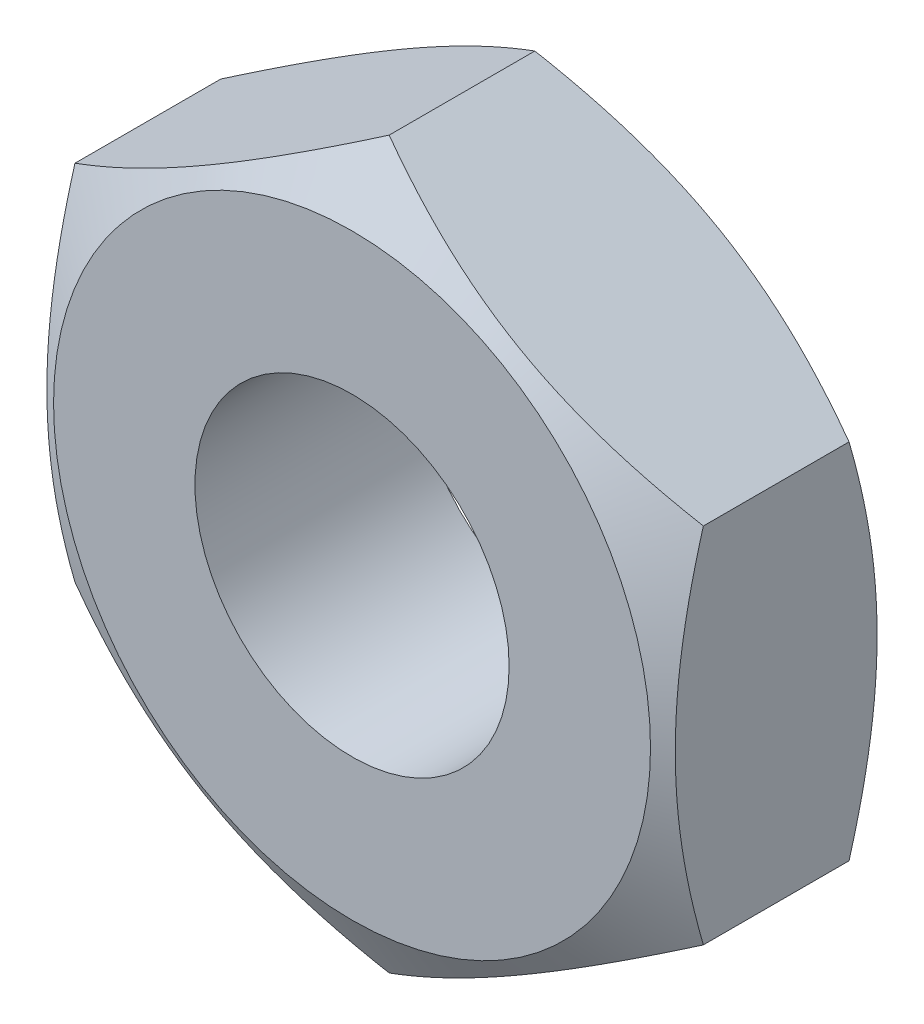
ISO-10303-21;
HEADER;
FILE_DESCRIPTION(('STEP AP214'),'2;1');
FILE_NAME('part.step','',(''),(''),'','','');
FILE_SCHEMA(('AUTOMOTIVE_DESIGN { 1 0 10303 214 1 1 1 1 }'));
ENDSEC;
DATA;
#1=APPLICATION_CONTEXT('core data for automotive mechanical design processes');
#2=APPLICATION_PROTOCOL_DEFINITION('international standard','automotive_design',2000,#1);
#3=PRODUCT_CONTEXT('',#1,'mechanical');
#4=PRODUCT('Part','Part','',(#3));
#5=PRODUCT_RELATED_PRODUCT_CATEGORY('part','',(#4));
#6=PRODUCT_DEFINITION_FORMATION('','',#4);
#7=PRODUCT_DEFINITION_CONTEXT('part definition',#1,'design');
#8=PRODUCT_DEFINITION('design','',#6,#7);
#9=PRODUCT_DEFINITION_SHAPE('','',#8);
#10=(LENGTH_UNIT() NAMED_UNIT(*) SI_UNIT(.MILLI.,.METRE.));
#11=(NAMED_UNIT(*) PLANE_ANGLE_UNIT() SI_UNIT($,.RADIAN.));
#12=(NAMED_UNIT(*) SI_UNIT($,.STERADIAN.) SOLID_ANGLE_UNIT());
#13=UNCERTAINTY_MEASURE_WITH_UNIT(LENGTH_MEASURE(1.E-05),#10,'distance_accuracy_value','');
#14=(GEOMETRIC_REPRESENTATION_CONTEXT(3) GLOBAL_UNCERTAINTY_ASSIGNED_CONTEXT((#13)) GLOBAL_UNIT_ASSIGNED_CONTEXT((#10,
#11,#12)) REPRESENTATION_CONTEXT('',''));
#15=CARTESIAN_POINT('',(0.,0.,0.));
#16=DIRECTION('',(0.,0.,1.));
#17=DIRECTION('',(1.,0.,0.));
#18=AXIS2_PLACEMENT_3D('',#15,#16,#17);
#19=CARTESIAN_POINT('',(0.,0.,1.75));
#20=DIRECTION('',(0.,0.,1.));
#21=DIRECTION('',(1.,0.,0.));
#22=AXIS2_PLACEMENT_3D('',#19,#20,#21);
#23=PLANE('',#22);
#24=CARTESIAN_POINT('',(0.,0.,1.75));
#25=DIRECTION('',(0.,0.,1.));
#26=DIRECTION('',(1.,0.,0.));
#27=AXIS2_PLACEMENT_3D('',#24,#25,#26);
#28=CIRCLE('',#27,1.25);
#29=CARTESIAN_POINT('',(1.25,0.,1.75));
#30=VERTEX_POINT('',#29);
#31=EDGE_CURVE('E116',#30,#30,#28,.T.);
#32=ORIENTED_EDGE('',*,*,#31,.F.);
#33=EDGE_LOOP('',(#32));
#34=FACE_BOUND('',#33,.T.);
#35=CARTESIAN_POINT('',(0.,0.,1.75));
#36=DIRECTION('',(0.,0.,1.));
#37=DIRECTION('',(0.,-1.,0.));
#38=AXIS2_PLACEMENT_3D('',#35,#36,#37);
#39=CIRCLE('',#38,2.375);
#40=CARTESIAN_POINT('',(0.,-2.375,1.75));
#41=VERTEX_POINT('',#40);
#42=EDGE_CURVE('E109',#41,#41,#39,.T.);
#43=ORIENTED_EDGE('',*,*,#42,.T.);
#44=EDGE_LOOP('',(#43));
#45=FACE_BOUND('',#44,.T.);
#46=ADVANCED_FACE('F37',(#34,#45),#23,.T.);
#47=CARTESIAN_POINT('',(0.,0.,0.));
#48=DIRECTION('',(0.,0.,1.));
#49=DIRECTION('',(1.,0.,0.));
#50=AXIS2_PLACEMENT_3D('',#47,#48,#49);
#51=PLANE('',#50);
#52=CARTESIAN_POINT('',(0.,0.,0.));
#53=DIRECTION('',(0.,0.,1.));
#54=DIRECTION('',(1.,0.,0.));
#55=AXIS2_PLACEMENT_3D('',#52,#53,#54);
#56=CIRCLE('',#55,1.25);
#57=CARTESIAN_POINT('',(1.25,0.,0.));
#58=VERTEX_POINT('',#57);
#59=EDGE_CURVE('E196',#58,#58,#56,.T.);
#60=ORIENTED_EDGE('',*,*,#59,.T.);
#61=EDGE_LOOP('',(#60));
#62=FACE_BOUND('',#61,.T.);
#63=CARTESIAN_POINT('',(0.,0.,0.));
#64=DIRECTION('',(0.,0.,1.));
#65=DIRECTION('',(0.,-1.,0.));
#66=AXIS2_PLACEMENT_3D('',#63,#64,#65);
#67=CIRCLE('',#66,2.375);
#68=CARTESIAN_POINT('',(0.,-2.375,0.));
#69=VERTEX_POINT('',#68);
#70=EDGE_CURVE('E218',#69,#69,#67,.T.);
#71=ORIENTED_EDGE('',*,*,#70,.F.);
#72=EDGE_LOOP('',(#71));
#73=FACE_BOUND('',#72,.T.);
#74=ADVANCED_FACE('F201',(#62,#73),#51,.F.);
#75=CARTESIAN_POINT('',(0.,0.,1.75));
#76=DIRECTION('',(0.,0.,-1.));
#77=DIRECTION('',(-1.,0.,0.));
#78=AXIS2_PLACEMENT_3D('',#75,#76,#77);
#79=CYLINDRICAL_SURFACE('',#78,1.25);
#80=ORIENTED_EDGE('',*,*,#31,.T.);
#81=EDGE_LOOP('',(#80));
#82=FACE_BOUND('',#81,.T.);
#83=ORIENTED_EDGE('',*,*,#59,.F.);
#84=EDGE_LOOP('',(#83));
#85=FACE_BOUND('',#84,.T.);
#86=ADVANCED_FACE('F137',(#82,#85),#79,.F.);
#87=CARTESIAN_POINT('',(0.,0.,0.));
#88=DIRECTION('',(0.,0.,1.));
#89=DIRECTION('',(0.,-1.,0.));
#90=AXIS2_PLACEMENT_3D('',#87,#88,#89);
#91=CONICAL_SURFACE('',#90,2.375,1.0471975511966);
#92=ORIENTED_EDGE('',*,*,#70,.T.);
#93=EDGE_LOOP('',(#92));
#94=FACE_BOUND('',#93,.T.);
#95=CARTESIAN_POINT('',(2.5,-3.86763946392755,1.2876547106161));
#96=CARTESIAN_POINT('',(2.5,-3.75852551583649,1.23476270966801));
#97=CARTESIAN_POINT('',(2.5,-3.64916006780465,1.18238060529101));
#98=CARTESIAN_POINT('',(2.5,-3.42979238777927,1.07892316223086));
#99=CARTESIAN_POINT('',(2.5,-3.31979005786967,1.02784803139998));
#100=CARTESIAN_POINT('',(2.5,-3.09844353829973,0.927032534868438));
#101=CARTESIAN_POINT('',(2.5,-2.98709529758184,0.877301032608486));
#102=CARTESIAN_POINT('',(2.5,-2.763509858222,0.779885915241073));
#103=CARTESIAN_POINT('',(2.5,-2.65127270216652,0.732202202721919));
#104=CARTESIAN_POINT('',(2.5,-2.42214755064801,0.637949580190284));
#105=CARTESIAN_POINT('',(2.5,-2.30522503270314,0.591464132652693));
#106=CARTESIAN_POINT('',(2.5,-2.07000857851044,0.502034372702592));
#107=CARTESIAN_POINT('',(2.5,-1.95171448954618,0.459090459022853));
#108=CARTESIAN_POINT('',(2.5,-1.71379120381976,0.37787801577161));
#109=CARTESIAN_POINT('',(2.5,-1.59416529867955,0.339599940278691));
#110=CARTESIAN_POINT('',(2.5,-1.35319758460224,0.268953701601422));
#111=CARTESIAN_POINT('',(2.5,-1.23185633217851,0.236583667012194));
#112=CARTESIAN_POINT('',(2.5,-0.988059377504647,0.179484531718637));
#113=CARTESIAN_POINT('',(2.5,-0.865613455515869,0.154714443946999));
#114=CARTESIAN_POINT('',(2.5,-0.619208800947298,0.114222367082637));
#115=CARTESIAN_POINT('',(2.5,-0.495250210215586,0.0984995361558203));
#116=CARTESIAN_POINT('',(2.5,-0.248054781354333,0.0775622736933038));
#117=CARTESIAN_POINT('',(2.5,-0.124829609324288,0.0722134876273881));
#118=CARTESIAN_POINT('',(2.5,0.121634587761786,0.0721246690618955));
#119=CARTESIAN_POINT('',(2.5,0.244873613061071,0.0773848676112145));
#120=CARTESIAN_POINT('',(2.5,0.454374089317983,0.0949742062526064));
#121=CARTESIAN_POINT('',(2.5,0.540860910537124,0.104772198187143));
#122=CARTESIAN_POINT('',(2.5,0.71319319520709,0.128977756388591));
#123=CARTESIAN_POINT('',(2.5,0.799038568697896,0.143385957243784));
#124=CARTESIAN_POINT('',(2.5,1.05549131811364,0.192769927586583));
#125=CARTESIAN_POINT('',(2.5,1.22491769803913,0.233895793155265));
#126=CARTESIAN_POINT('',(2.5,1.56399109003585,0.329140332292541));
#127=CARTESIAN_POINT('',(2.5,1.73356005553691,0.383526326465631));
#128=CARTESIAN_POINT('',(2.5,1.98556190300135,0.471619784669561));
#129=CARTESIAN_POINT('',(2.5,2.06916180670617,0.502066425736758));
#130=CARTESIAN_POINT('',(2.5,2.23567245075201,0.564789103682635));
#131=CARTESIAN_POINT('',(2.5,2.31858319901662,0.597065119494532));
#132=CARTESIAN_POINT('',(2.5,2.5136844428125,0.675092139926096));
#133=CARTESIAN_POINT('',(2.5,2.62561423262604,0.721493115013614));
#134=CARTESIAN_POINT('',(2.5,2.84852673344899,0.816522186017045));
#135=CARTESIAN_POINT('',(2.5,2.95950939063121,0.865150407524381));
#136=CARTESIAN_POINT('',(2.5,3.29131956302076,1.01368578341017));
#137=CARTESIAN_POINT('',(2.5,3.51096663954438,1.11622616340681));
#138=CARTESIAN_POINT('',(2.5,3.94827453766853,1.32596159051718));
#139=CARTESIAN_POINT('',(2.5,4.16593313820459,1.43316121755294));
#140=CARTESIAN_POINT('',(2.5,4.59968673432788,1.65069000943157));
#141=CARTESIAN_POINT('',(2.5,4.8157816731443,1.76101928719212));
#142=CARTESIAN_POINT('',(2.5,5.22882322283796,1.97458148645121));
#143=CARTESIAN_POINT('',(2.5,5.42586165180805,2.07763744333484));
#144=CARTESIAN_POINT('',(2.5,5.81920826161873,2.28514868976634));
#145=CARTESIAN_POINT('',(2.5,6.01551641676818,2.3896040279608));
#146=CARTESIAN_POINT('',(2.5,6.40707981927931,2.59932311390836));
#147=CARTESIAN_POINT('',(2.5,6.60233646830583,2.70458424849236));
#148=CARTESIAN_POINT('',(2.5,6.99238254653373,2.91594374155117));
#149=CARTESIAN_POINT('',(2.5,7.1871720006058,3.02204205410905));
#150=CARTESIAN_POINT('',(2.5,7.38178938540182,3.12845289523728));
#151=B_SPLINE_CURVE_WITH_KNOTS('',3,(#95,#96,#97,#98,#99,#100,#101,#102,#103,#104,#105,#106,
#107,#108,#109,#110,#111,#112,#113,#114,#115,#116,#117,#118,#119,#120,#121,#122,#123,#124,#125,
#126,#127,#128,#129,#130,#131,#132,#133,#134,#135,#136,#137,#138,#139,#140,#141,#142,#143,#144,
#145,#146,#147,#148,#149,#150),.UNSPECIFIED.,.F.,.F.,(4,2,2,2,2,2,2,2,2,2,2,2,2,2,2,2,2,2,2,2,2,
2,2,2,2,2,2,4),(0.,0.363777438860027,0.727612375341775,1.09344403056899,1.45925826416178,
1.83668704075984,2.21415825330651,2.59084374525286,2.96740971210786,3.34190760940305,
3.71637065457635,4.08595075587306,4.4555389061961,4.71653329113484,4.9775636170216,
5.49991709335266,6.03382700833079,6.30072511977744,6.56762015829288,6.93108793833044,
7.29457623912,8.02169102368103,8.74953746575718,9.47741020198852,10.1444884101497,
10.8115898683916,11.477054113278,12.1424821095168),.UNSPECIFIED.);
#152=CARTESIAN_POINT('',(2.5,-1.44337567297453,0.29545977734099));
#153=VERTEX_POINT('',#152);
#154=CARTESIAN_POINT('',(2.5,1.44337567297407,0.295459777341305));
#155=VERTEX_POINT('',#154);
#156=EDGE_CURVE('E51',#153,#155,#151,.T.);
#157=ORIENTED_EDGE('',*,*,#156,.F.);
#158=CARTESIAN_POINT('',(-0.000200000000000318,-2.88686681600197,0.295526448007812));
#159=CARTESIAN_POINT('',(0.109663234734871,-2.82343724785375,0.258890403756329));
#160=CARTESIAN_POINT('',(0.220474799896525,-2.75946016087834,0.22557100261376));
#161=CARTESIAN_POINT('',(0.444016833466049,-2.63039810762178,0.167411069206561));
#162=CARTESIAN_POINT('',(0.556751274528388,-2.5653108477275,0.142591112796441));
#163=CARTESIAN_POINT('',(0.780822993875269,-2.43594298024479,0.103954435089755));
#164=CARTESIAN_POINT('',(0.892125791767377,-2.37168227992023,0.0898805798343417));
#165=CARTESIAN_POINT('',(1.11525522746833,-2.24285844015415,0.073077936001453));
#166=CARTESIAN_POINT('',(1.22708105401423,-2.17829576909553,0.0703352348523293));
#167=CARTESIAN_POINT('',(1.43604197555152,-2.05765212479586,0.0760345436567563));
#168=CARTESIAN_POINT('',(1.53320831755773,-2.0015531110824,0.0830771780305646));
#169=CARTESIAN_POINT('',(1.726907949711,-1.88972057631678,0.105400202773646));
#170=CARTESIAN_POINT('',(1.82344056965973,-1.8339874422038,0.12068822208897));
#171=CARTESIAN_POINT('',(2.01753972174048,-1.7219242445005,0.158907877493124));
#172=CARTESIAN_POINT('',(2.11508168178214,-1.66560836761316,0.182001559774221));
#173=CARTESIAN_POINT('',(2.30871060807609,-1.55381665489446,0.234415440226617));
#174=CARTESIAN_POINT('',(2.40480005588618,-1.49833938633502,0.263723319273252));
#175=CARTESIAN_POINT('',(2.5002,-1.44326020292023,0.295526448007812));
#176=B_SPLINE_CURVE_WITH_KNOTS('',3,(#158,#159,#160,#161,#162,#163,#164,#165,#166,#167,#168,
#169,#170,#171,#172,#173,#174,#175),.UNSPECIFIED.,.F.,.F.,(4,2,2,2,2,2,2,2,4),(0.,
0.396285827362227,0.793524330152051,1.18093086852114,1.56786160134475,1.90479741793733,
2.24204551660463,2.58677531536756,2.93082800105257),.UNSPECIFIED.);
#177=CARTESIAN_POINT('',(0.,-2.88675134594813,0.295459777341305));
#178=VERTEX_POINT('',#177);
#179=EDGE_CURVE('E94',#178,#153,#176,.T.);
#180=ORIENTED_EDGE('',*,*,#179,.F.);
#181=CARTESIAN_POINT('',(-2.5002,-1.44326020292023,0.295526448007812));
#182=CARTESIAN_POINT('',(-2.39033676526513,-1.50668977106845,0.258890403756329));
#183=CARTESIAN_POINT('',(-2.27952520010347,-1.57066685804385,0.225571002613759));
#184=CARTESIAN_POINT('',(-2.05598316653395,-1.69972891130041,0.167411069206561));
#185=CARTESIAN_POINT('',(-1.94324872547161,-1.7648161711947,0.142591112796442));
#186=CARTESIAN_POINT('',(-1.71917700612473,-1.8941840386774,0.103954435089755));
#187=CARTESIAN_POINT('',(-1.60787420823262,-1.95844473900197,0.089880579834342));
#188=CARTESIAN_POINT('',(-1.38474477253167,-2.08726857876805,0.0730779360014533));
#189=CARTESIAN_POINT('',(-1.27291894598577,-2.15183124982667,0.0703352348523298));
#190=CARTESIAN_POINT('',(-1.06395802444848,-2.27247489412634,0.0760345436567566));
#191=CARTESIAN_POINT('',(-0.966791682442269,-2.32857390783979,0.0830771780305647));
#192=CARTESIAN_POINT('',(-0.773092050288997,-2.44040644260542,0.105400202773646));
#193=CARTESIAN_POINT('',(-0.676559430340268,-2.4961395767184,0.12068822208897));
#194=CARTESIAN_POINT('',(-0.482460278259524,-2.60820277442169,0.158907877493124));
#195=CARTESIAN_POINT('',(-0.384918318217859,-2.66451865130903,0.18200155977422));
#196=CARTESIAN_POINT('',(-0.191289391923915,-2.77631036402774,0.234415440226616));
#197=CARTESIAN_POINT('',(-0.0951999441138243,-2.83178763258718,0.263723319273252));
#198=CARTESIAN_POINT('',(0.000199999999999583,-2.88686681600197,0.295526448007812));
#199=B_SPLINE_CURVE_WITH_KNOTS('',3,(#181,#182,#183,#184,#185,#186,#187,#188,#189,#190,#191,
#192,#193,#194,#195,#196,#197,#198),.UNSPECIFIED.,.F.,.F.,(4,2,2,2,2,2,2,2,4),(0.,
0.396285827362227,0.793524330152051,1.18093086852114,1.56786160134475,1.90479741793733,
2.24204551660463,2.58677531536756,2.93082800105256),.UNSPECIFIED.);
#200=CARTESIAN_POINT('',(-2.5,-1.44337567297407,0.295459777341305));
#201=VERTEX_POINT('',#200);
#202=EDGE_CURVE('E108',#201,#178,#199,.T.);
#203=ORIENTED_EDGE('',*,*,#202,.F.);
#204=CARTESIAN_POINT('',(-2.5,-3.86763946389854,1.28765471060203));
#205=CARTESIAN_POINT('',(-2.5,-3.75852551580845,1.23476270965453));
#206=CARTESIAN_POINT('',(-2.5,-3.64916006777759,1.18238060527812));
#207=CARTESIAN_POINT('',(-2.5,-3.42979238775417,1.07892316221915));
#208=CARTESIAN_POINT('',(-2.5,-3.31979005784554,1.02784803138885));
#209=CARTESIAN_POINT('',(-2.5,-3.09844353827758,0.927032534858483));
#210=CARTESIAN_POINT('',(-2.5,-2.98709529756068,0.877301032599117));
#211=CARTESIAN_POINT('',(-2.5,-2.76350985820283,0.779885915232867));
#212=CARTESIAN_POINT('',(-2.5,-2.65127270214835,0.73220220271429));
#213=CARTESIAN_POINT('',(-2.5,-2.42214755063191,0.637949580183822));
#214=CARTESIAN_POINT('',(-2.5,-2.30522503268812,0.59146413264682));
#215=CARTESIAN_POINT('',(-2.5,-2.07000857849758,0.502034372697865));
#216=CARTESIAN_POINT('',(-2.5,-1.95171448953441,0.459090459018684));
#217=CARTESIAN_POINT('',(-2.5,-1.7137912038102,0.3778780157685));
#218=CARTESIAN_POINT('',(-2.5,-1.59416529867111,0.339599940276083));
#219=CARTESIAN_POINT('',(-2.5,-1.35319758459605,0.268953701599735));
#220=CARTESIAN_POINT('',(-2.5,-1.23185633217346,0.236583667010927));
#221=CARTESIAN_POINT('',(-2.5,-0.988059377502483,0.179484531718212));
#222=CARTESIAN_POINT('',(-2.5,-0.865613455515453,0.154714443946965));
#223=CARTESIAN_POINT('',(-2.5,-0.619208800950423,0.114222367083116));
#224=CARTESIAN_POINT('',(-2.5,-0.495250210220502,0.0984995361564233));
#225=CARTESIAN_POINT('',(-2.5,-0.248054781362798,0.0775622736938365));
#226=CARTESIAN_POINT('',(-2.5,-0.124829609334513,0.0722134876277324));
#227=CARTESIAN_POINT('',(-2.5,0.121634587748071,0.07212466906156));
#228=CARTESIAN_POINT('',(-2.5,0.244873613045626,0.0773848676103875));
#229=CARTESIAN_POINT('',(-2.5,0.454374089300341,0.0949742062507923));
#230=CARTESIAN_POINT('',(-2.5,0.540860910518998,0.104772198184935));
#231=CARTESIAN_POINT('',(-2.5,0.713193195188015,0.128977756385575));
#232=CARTESIAN_POINT('',(-2.5,0.799038568678358,0.143385957240352));
#233=CARTESIAN_POINT('',(-2.5,1.05549131809274,0.192769927581897));
#234=CARTESIAN_POINT('',(-2.5,1.22491769801735,0.233895793149731));
#235=CARTESIAN_POINT('',(-2.5,1.56399109001231,0.32914033228533));
#236=CARTESIAN_POINT('',(-2.5,1.73356005551248,0.38352632645759));
#237=CARTESIAN_POINT('',(-2.5,1.98556190297561,0.471619784660316));
#238=CARTESIAN_POINT('',(-2.5,2.06916180667999,0.502066425727119));
#239=CARTESIAN_POINT('',(-2.5,2.23567245072495,0.564789103672221));
#240=CARTESIAN_POINT('',(-2.5,2.31858319898912,0.597065119483736));
#241=CARTESIAN_POINT('',(-2.5,2.5136844427847,0.675092139914706));
#242=CARTESIAN_POINT('',(-2.5,2.62561423259837,0.721493115002036));
#243=CARTESIAN_POINT('',(-2.5,2.84852673342155,0.816522186005133));
#244=CARTESIAN_POINT('',(-2.5,2.95950939060389,0.865150407512324));
#245=CARTESIAN_POINT('',(-2.5,3.29131956299375,1.01368578339773));
#246=CARTESIAN_POINT('',(-2.5,3.51096663951756,1.11622616339418));
#247=CARTESIAN_POINT('',(-2.5,3.94827453764206,1.32596159050425));
#248=CARTESIAN_POINT('',(-2.5,4.16593313817829,1.4331612175399));
#249=CARTESIAN_POINT('',(-2.5,4.59968673430187,1.65069000941837));
#250=CARTESIAN_POINT('',(-2.5,4.81578167311844,1.76101928717886));
#251=CARTESIAN_POINT('',(-2.5,5.22882322281225,1.97458148643781));
#252=CARTESIAN_POINT('',(-2.5,5.42586165178236,2.07763744332137));
#253=CARTESIAN_POINT('',(-2.5,5.81920826159307,2.28514868975272));
#254=CARTESIAN_POINT('',(-2.5,6.01551641674254,2.38960402794712));
#255=CARTESIAN_POINT('',(-2.5,6.40707981925366,2.59932311389456));
#256=CARTESIAN_POINT('',(-2.5,6.60233646828017,2.7045842484785));
#257=CARTESIAN_POINT('',(-2.5,6.99238254650804,2.9159437415372));
#258=CARTESIAN_POINT('',(-2.5,7.18717200058009,3.02204205409503));
#259=CARTESIAN_POINT('',(-2.5,7.3817893853761,3.12845289522321));
#260=B_SPLINE_CURVE_WITH_KNOTS('',3,(#204,#205,#206,#207,#208,#209,#210,#211,#212,#213,#214,
#215,#216,#217,#218,#219,#220,#221,#222,#223,#224,#225,#226,#227,#228,#229,#230,#231,#232,#233,
#234,#235,#236,#237,#238,#239,#240,#241,#242,#243,#244,#245,#246,#247,#248,#249,#250,#251,#252,
#253,#254,#255,#256,#257,#258,#259),.UNSPECIFIED.,.F.,.F.,(4,2,2,2,2,2,2,2,2,2,2,2,2,2,2,2,2,2,
2,2,2,2,2,2,2,2,2,4),(0.,0.363777438856627,0.727612375334975,1.09344403055875,1.4592582641481,
1.83668704074251,2.21415825328553,2.59084374522825,2.96740971207962,3.34190760936945,
3.71637065453738,4.08595075582887,4.45553890614668,4.71653329108384,4.97756361696902,
5.49991709329692,6.03382700827176,6.30072511971677,6.56762015823057,6.93108793826827,
7.29457623905795,8.02169102361925,8.74953746569569,9.47741020192732,10.1444884100885,
10.8115898683303,11.4770541132166,12.1424821094552),.UNSPECIFIED.);
#261=CARTESIAN_POINT('',(-2.5,1.44337567297406,0.295459777341306));
#262=VERTEX_POINT('',#261);
#263=EDGE_CURVE('E157',#262,#201,#260,.F.);
#264=ORIENTED_EDGE('',*,*,#263,.F.);
#265=CARTESIAN_POINT('',(0.000199999999999662,2.88686681600197,0.295526448007812));
#266=CARTESIAN_POINT('',(-0.109663234734871,2.82343724785375,0.258890403756329));
#267=CARTESIAN_POINT('',(-0.220474799896526,2.75946016087834,0.22557100261376));
#268=CARTESIAN_POINT('',(-0.44401683346605,2.63039810762178,0.167411069206561));
#269=CARTESIAN_POINT('',(-0.556751274528389,2.5653108477275,0.142591112796441));
#270=CARTESIAN_POINT('',(-0.780822993875269,2.43594298024479,0.103954435089755));
#271=CARTESIAN_POINT('',(-0.892125791767377,2.37168227992023,0.089880579834342));
#272=CARTESIAN_POINT('',(-1.11525522746833,2.24285844015415,0.0730779360014533));
#273=CARTESIAN_POINT('',(-1.22708105401423,2.17829576909552,0.0703352348523297));
#274=CARTESIAN_POINT('',(-1.43604197555152,2.05765212479586,0.0760345436567566));
#275=CARTESIAN_POINT('',(-1.53320831755773,2.0015531110824,0.0830771780305648));
#276=CARTESIAN_POINT('',(-1.726907949711,1.88972057631678,0.105400202773646));
#277=CARTESIAN_POINT('',(-1.82344056965973,1.8339874422038,0.12068822208897));
#278=CARTESIAN_POINT('',(-2.01753972174048,1.7219242445005,0.158907877493124));
#279=CARTESIAN_POINT('',(-2.11508168178214,1.66560836761316,0.182001559774221));
#280=CARTESIAN_POINT('',(-2.30871060807609,1.55381665489446,0.234415440226617));
#281=CARTESIAN_POINT('',(-2.40480005588618,1.49833938633502,0.263723319273252));
#282=CARTESIAN_POINT('',(-2.5002,1.44326020292023,0.295526448007812));
#283=B_SPLINE_CURVE_WITH_KNOTS('',3,(#265,#266,#267,#268,#269,#270,#271,#272,#273,#274,#275,
#276,#277,#278,#279,#280,#281,#282),.UNSPECIFIED.,.F.,.F.,(4,2,2,2,2,2,2,2,4),(0.,
0.396285827362227,0.793524330152051,1.18093086852114,1.56786160134475,1.90479741793733,
2.24204551660463,2.58677531536756,2.93082800105257),.UNSPECIFIED.);
#284=CARTESIAN_POINT('',(0.,2.88675134594813,0.295459777341305));
#285=VERTEX_POINT('',#284);
#286=EDGE_CURVE('E163',#285,#262,#283,.T.);
#287=ORIENTED_EDGE('',*,*,#286,.F.);
#288=CARTESIAN_POINT('',(2.5002,1.44326020292023,0.295526448007812));
#289=CARTESIAN_POINT('',(2.39033676526513,1.50668977106845,0.258890403756329));
#290=CARTESIAN_POINT('',(2.27952520010347,1.57066685804385,0.22557100261376));
#291=CARTESIAN_POINT('',(2.05598316653395,1.69972891130041,0.167411069206561));
#292=CARTESIAN_POINT('',(1.94324872547161,1.7648161711947,0.142591112796442));
#293=CARTESIAN_POINT('',(1.71917700612473,1.8941840386774,0.103954435089755));
#294=CARTESIAN_POINT('',(1.60787420823262,1.95844473900197,0.0898805798343421));
#295=CARTESIAN_POINT('',(1.38474477253167,2.08726857876804,0.0730779360014533));
#296=CARTESIAN_POINT('',(1.27291894598577,2.15183124982667,0.0703352348523297));
#297=CARTESIAN_POINT('',(1.06395802444848,2.27247489412634,0.0760345436567567));
#298=CARTESIAN_POINT('',(0.966791682442268,2.32857390783979,0.0830771780305649));
#299=CARTESIAN_POINT('',(0.773092050288997,2.44040644260542,0.105400202773646));
#300=CARTESIAN_POINT('',(0.676559430340267,2.4961395767184,0.12068822208897));
#301=CARTESIAN_POINT('',(0.482460278259524,2.60820277442169,0.158907877493124));
#302=CARTESIAN_POINT('',(0.384918318217859,2.66451865130903,0.182001559774221));
#303=CARTESIAN_POINT('',(0.191289391923914,2.77631036402774,0.234415440226617));
#304=CARTESIAN_POINT('',(0.0951999441138234,2.83178763258717,0.263723319273252));
#305=CARTESIAN_POINT('',(-0.000200000000000666,2.88686681600197,0.295526448007812));
#306=B_SPLINE_CURVE_WITH_KNOTS('',3,(#288,#289,#290,#291,#292,#293,#294,#295,#296,#297,#298,
#299,#300,#301,#302,#303,#304,#305),.UNSPECIFIED.,.F.,.F.,(4,2,2,2,2,2,2,2,4),(0.,
0.396285827362227,0.793524330152051,1.18093086852114,1.56786160134475,1.90479741793733,
2.24204551660463,2.58677531536756,2.93082800105256),.UNSPECIFIED.);
#307=EDGE_CURVE('E65',#155,#285,#306,.T.);
#308=ORIENTED_EDGE('',*,*,#307,.F.);
#309=EDGE_LOOP('',(#157,#180,#203,#264,#287,#308));
#310=FACE_BOUND('',#309,.T.);
#311=ADVANCED_FACE('F93',(#94,#310),#91,.T.);
#312=CARTESIAN_POINT('',(0.,0.,1.75));
#313=DIRECTION('',(0.,0.,-1.));
#314=DIRECTION('',(0.,1.,0.));
#315=AXIS2_PLACEMENT_3D('',#312,#313,#314);
#316=CONICAL_SURFACE('',#315,2.375,1.0471975511966);
#317=ORIENTED_EDGE('',*,*,#42,.F.);
#318=EDGE_LOOP('',(#317));
#319=FACE_BOUND('',#318,.T.);
#320=CARTESIAN_POINT('',(2.5002,1.44326020292023,1.45447355199219));
#321=CARTESIAN_POINT('',(2.39033676526513,1.50668977106845,1.49110959624367));
#322=CARTESIAN_POINT('',(2.27952520010347,1.57066685804385,1.52442899738624));
#323=CARTESIAN_POINT('',(2.05598316653395,1.69972891130041,1.58258893079344));
#324=CARTESIAN_POINT('',(1.94324872547161,1.7648161711947,1.60740888720356));
#325=CARTESIAN_POINT('',(1.71917700612473,1.8941840386774,1.64604556491025));
#326=CARTESIAN_POINT('',(1.60787420823262,1.95844473900197,1.66011942016566));
#327=CARTESIAN_POINT('',(1.38474477253166,2.08726857876804,1.67692206399855));
#328=CARTESIAN_POINT('',(1.27291894598577,2.15183124982667,1.67966476514767));
#329=CARTESIAN_POINT('',(1.06395802444848,2.27247489412634,1.67396545634324));
#330=CARTESIAN_POINT('',(0.966791682442268,2.32857390783979,1.66692282196944));
#331=CARTESIAN_POINT('',(0.773092050288997,2.44040644260542,1.64459979722635));
#332=CARTESIAN_POINT('',(0.676559430340267,2.4961395767184,1.62931177791103));
#333=CARTESIAN_POINT('',(0.482460278259523,2.60820277442169,1.59109212250688));
#334=CARTESIAN_POINT('',(0.384918318217859,2.66451865130903,1.56799844022578));
#335=CARTESIAN_POINT('',(0.191289391923915,2.77631036402774,1.51558455977338));
#336=CARTESIAN_POINT('',(0.095199944113824,2.83178763258717,1.48627668072675));
#337=CARTESIAN_POINT('',(-0.000200000000000028,2.88686681600197,1.45447355199219));
#338=B_SPLINE_CURVE_WITH_KNOTS('',3,(#320,#321,#322,#323,#324,#325,#326,#327,#328,#329,#330,
#331,#332,#333,#334,#335,#336,#337),.UNSPECIFIED.,.F.,.F.,(4,2,2,2,2,2,2,2,4),(0.,
0.396285827362227,0.793524330152052,1.18093086852114,1.56786160134475,1.90479741793733,
2.24204551660463,2.58677531536756,2.93082800105256),.UNSPECIFIED.);
#339=CARTESIAN_POINT('',(2.5,1.44337567297407,1.45454022265869));
#340=VERTEX_POINT('',#339);
#341=CARTESIAN_POINT('',(0.,2.88675134594813,1.45454022265869));
#342=VERTEX_POINT('',#341);
#343=EDGE_CURVE('E186',#340,#342,#338,.T.);
#344=ORIENTED_EDGE('',*,*,#343,.T.);
#345=CARTESIAN_POINT('',(0.000199999999999676,2.88686681600197,1.45447355199219));
#346=CARTESIAN_POINT('',(-0.109663234734871,2.82343724785375,1.49110959624367));
#347=CARTESIAN_POINT('',(-0.220474799896526,2.75946016087834,1.52442899738624));
#348=CARTESIAN_POINT('',(-0.44401683346605,2.63039810762178,1.58258893079344));
#349=CARTESIAN_POINT('',(-0.556751274528389,2.5653108477275,1.60740888720356));
#350=CARTESIAN_POINT('',(-0.780822993875269,2.43594298024479,1.64604556491025));
#351=CARTESIAN_POINT('',(-0.892125791767377,2.37168227992023,1.66011942016566));
#352=CARTESIAN_POINT('',(-1.11525522746833,2.24285844015415,1.67692206399855));
#353=CARTESIAN_POINT('',(-1.22708105401423,2.17829576909552,1.67966476514767));
#354=CARTESIAN_POINT('',(-1.43604197555152,2.05765212479586,1.67396545634324));
#355=CARTESIAN_POINT('',(-1.53320831755773,2.0015531110824,1.66692282196944));
#356=CARTESIAN_POINT('',(-1.726907949711,1.88972057631678,1.64459979722635));
#357=CARTESIAN_POINT('',(-1.82344056965973,1.8339874422038,1.62931177791103));
#358=CARTESIAN_POINT('',(-2.01753972174048,1.7219242445005,1.59109212250688));
#359=CARTESIAN_POINT('',(-2.11508168178214,1.66560836761316,1.56799844022578));
#360=CARTESIAN_POINT('',(-2.30871060807609,1.55381665489446,1.51558455977338));
#361=CARTESIAN_POINT('',(-2.40480005588618,1.49833938633502,1.48627668072675));
#362=CARTESIAN_POINT('',(-2.5002,1.44326020292023,1.45447355199219));
#363=B_SPLINE_CURVE_WITH_KNOTS('',3,(#345,#346,#347,#348,#349,#350,#351,#352,#353,#354,#355,
#356,#357,#358,#359,#360,#361,#362),.UNSPECIFIED.,.F.,.F.,(4,2,2,2,2,2,2,2,4),(0.,
0.396285827362227,0.793524330152051,1.18093086852114,1.56786160134475,1.90479741793733,
2.24204551660463,2.58677531536756,2.93082800105257),.UNSPECIFIED.);
#364=CARTESIAN_POINT('',(-2.5,1.44337567297406,1.45454022265869));
#365=VERTEX_POINT('',#364);
#366=EDGE_CURVE('E180',#342,#365,#363,.T.);
#367=ORIENTED_EDGE('',*,*,#366,.T.);
#368=CARTESIAN_POINT('',(-2.5,-3.86763946389854,0.462345289397966));
#369=CARTESIAN_POINT('',(-2.5,-3.75852551580845,0.515237290345465));
#370=CARTESIAN_POINT('',(-2.5,-3.64916006777759,0.567619394721879));
#371=CARTESIAN_POINT('',(-2.5,-3.42979238775417,0.671076837780852));
#372=CARTESIAN_POINT('',(-2.5,-3.31979005784554,0.722151968611149));
#373=CARTESIAN_POINT('',(-2.5,-3.09844353827758,0.822967465141515));
#374=CARTESIAN_POINT('',(-2.5,-2.98709529756068,0.872698967400882));
#375=CARTESIAN_POINT('',(-2.5,-2.76350985820283,0.970114084767131));
#376=CARTESIAN_POINT('',(-2.5,-2.65127270214835,1.01779779728571));
#377=CARTESIAN_POINT('',(-2.5,-2.42214755063191,1.11205041981618));
#378=CARTESIAN_POINT('',(-2.5,-2.30522503268812,1.15853586735318));
#379=CARTESIAN_POINT('',(-2.5,-2.07000857849758,1.24796562730213));
#380=CARTESIAN_POINT('',(-2.5,-1.95171448953441,1.29090954098132));
#381=CARTESIAN_POINT('',(-2.5,-1.7137912038102,1.3721219842315));
#382=CARTESIAN_POINT('',(-2.5,-1.59416529867111,1.41040005972392));
#383=CARTESIAN_POINT('',(-2.5,-1.35319758459605,1.48104629840026));
#384=CARTESIAN_POINT('',(-2.5,-1.23185633217346,1.51341633298907));
#385=CARTESIAN_POINT('',(-2.5,-0.988059377502482,1.57051546828179));
#386=CARTESIAN_POINT('',(-2.5,-0.865613455515453,1.59528555605303));
#387=CARTESIAN_POINT('',(-2.5,-0.619208800950422,1.63577763291688));
#388=CARTESIAN_POINT('',(-2.5,-0.495250210220501,1.65150046384358));
#389=CARTESIAN_POINT('',(-2.5,-0.248054781362798,1.67243772630616));
#390=CARTESIAN_POINT('',(-2.5,-0.124829609334513,1.67778651237227));
#391=CARTESIAN_POINT('',(-2.5,0.121634587748072,1.67787533093844));
#392=CARTESIAN_POINT('',(-2.5,0.244873613045626,1.67261513238961));
#393=CARTESIAN_POINT('',(-2.5,0.454374089300341,1.65502579374921));
#394=CARTESIAN_POINT('',(-2.5,0.540860910518998,1.64522780181506));
#395=CARTESIAN_POINT('',(-2.5,0.713193195188015,1.62102224361442));
#396=CARTESIAN_POINT('',(-2.5,0.799038568678358,1.60661404275965));
#397=CARTESIAN_POINT('',(-2.5,1.05549131809274,1.5572300724181));
#398=CARTESIAN_POINT('',(-2.5,1.22491769801735,1.51610420685027));
#399=CARTESIAN_POINT('',(-2.5,1.56399109001231,1.42085966771467));
#400=CARTESIAN_POINT('',(-2.5,1.73356005551248,1.36647367354241));
#401=CARTESIAN_POINT('',(-2.5,1.98556190297561,1.27838021533968));
#402=CARTESIAN_POINT('',(-2.5,2.06916180667999,1.24793357427288));
#403=CARTESIAN_POINT('',(-2.5,2.23567245072495,1.18521089632778));
#404=CARTESIAN_POINT('',(-2.5,2.31858319898912,1.15293488051626));
#405=CARTESIAN_POINT('',(-2.5,2.5136844427847,1.07490786008529));
#406=CARTESIAN_POINT('',(-2.5,2.62561423259836,1.02850688499797));
#407=CARTESIAN_POINT('',(-2.5,2.84852673342155,0.933477813994868));
#408=CARTESIAN_POINT('',(-2.5,2.95950939060388,0.884849592487677));
#409=CARTESIAN_POINT('',(-2.5,3.29131956299375,0.736314216602267));
#410=CARTESIAN_POINT('',(-2.5,3.51096663951756,0.633773836605822));
#411=CARTESIAN_POINT('',(-2.5,3.94827453764206,0.424038409495748));
#412=CARTESIAN_POINT('',(-2.5,4.16593313817828,0.316838782460098));
#413=CARTESIAN_POINT('',(-2.5,4.59968673430187,0.0993099905816269));
#414=CARTESIAN_POINT('',(-2.5,4.81578167311844,-0.0110192871788629));
#415=CARTESIAN_POINT('',(-2.5,5.22882322281225,-0.224581486437811));
#416=CARTESIAN_POINT('',(-2.5,5.42586165178236,-0.327637443321367));
#417=CARTESIAN_POINT('',(-2.5,5.81920826159307,-0.535148689752723));
#418=CARTESIAN_POINT('',(-2.5,6.01551641674253,-0.639604027947122));
#419=CARTESIAN_POINT('',(-2.5,6.40707981925366,-0.849323113894562));
#420=CARTESIAN_POINT('',(-2.5,6.60233646828016,-0.954584248478503));
#421=CARTESIAN_POINT('',(-2.5,6.99238254650804,-1.1659437415372));
#422=CARTESIAN_POINT('',(-2.5,7.18717200058009,-1.27204205409503));
#423=CARTESIAN_POINT('',(-2.5,7.38178938537609,-1.37845289522321));
#424=B_SPLINE_CURVE_WITH_KNOTS('',3,(#368,#369,#370,#371,#372,#373,#374,#375,#376,#377,#378,
#379,#380,#381,#382,#383,#384,#385,#386,#387,#388,#389,#390,#391,#392,#393,#394,#395,#396,#397,
#398,#399,#400,#401,#402,#403,#404,#405,#406,#407,#408,#409,#410,#411,#412,#413,#414,#415,#416,
#417,#418,#419,#420,#421,#422,#423),.UNSPECIFIED.,.F.,.F.,(4,2,2,2,2,2,2,2,2,2,2,2,2,2,2,2,2,2,
2,2,2,2,2,2,2,2,2,4),(0.,0.363777438856628,0.727612375334976,1.09344403055875,1.4592582641481,
1.83668704074251,2.21415825328553,2.59084374522825,2.96740971207962,3.34190760936945,
3.71637065453739,4.08595075582887,4.45553890614668,4.71653329108384,4.97756361696902,
5.49991709329692,6.03382700827176,6.30072511971677,6.56762015823057,6.93108793826826,
7.29457623905795,8.02169102361924,8.74953746569569,9.47741020192732,10.1444884100885,
10.8115898683303,11.4770541132166,12.1424821094552),.UNSPECIFIED.);
#425=CARTESIAN_POINT('',(-2.5,-1.44337567297407,1.45454022265869));
#426=VERTEX_POINT('',#425);
#427=EDGE_CURVE('E187',#365,#426,#424,.F.);
#428=ORIENTED_EDGE('',*,*,#427,.T.);
#429=CARTESIAN_POINT('',(-2.5002,-1.44326020292023,1.45447355199219));
#430=CARTESIAN_POINT('',(-2.39033676526513,-1.50668977106845,1.49110959624367));
#431=CARTESIAN_POINT('',(-2.27952520010347,-1.57066685804385,1.52442899738624));
#432=CARTESIAN_POINT('',(-2.05598316653395,-1.69972891130041,1.58258893079344));
#433=CARTESIAN_POINT('',(-1.94324872547161,-1.7648161711947,1.60740888720356));
#434=CARTESIAN_POINT('',(-1.71917700612473,-1.8941840386774,1.64604556491024));
#435=CARTESIAN_POINT('',(-1.60787420823262,-1.95844473900197,1.66011942016566));
#436=CARTESIAN_POINT('',(-1.38474477253167,-2.08726857876805,1.67692206399855));
#437=CARTESIAN_POINT('',(-1.27291894598577,-2.15183124982667,1.67966476514767));
#438=CARTESIAN_POINT('',(-1.06395802444848,-2.27247489412634,1.67396545634324));
#439=CARTESIAN_POINT('',(-0.966791682442269,-2.32857390783979,1.66692282196943));
#440=CARTESIAN_POINT('',(-0.773092050288997,-2.44040644260542,1.64459979722635));
#441=CARTESIAN_POINT('',(-0.676559430340268,-2.4961395767184,1.62931177791103));
#442=CARTESIAN_POINT('',(-0.482460278259524,-2.60820277442169,1.59109212250688));
#443=CARTESIAN_POINT('',(-0.38491831821786,-2.66451865130903,1.56799844022578));
#444=CARTESIAN_POINT('',(-0.191289391923915,-2.77631036402774,1.51558455977338));
#445=CARTESIAN_POINT('',(-0.0951999441138238,-2.83178763258718,1.48627668072675));
#446=CARTESIAN_POINT('',(0.000199999999999987,-2.88686681600197,1.45447355199219));
#447=B_SPLINE_CURVE_WITH_KNOTS('',3,(#429,#430,#431,#432,#433,#434,#435,#436,#437,#438,#439,
#440,#441,#442,#443,#444,#445,#446),.UNSPECIFIED.,.F.,.F.,(4,2,2,2,2,2,2,2,4),(0.,
0.396285827362227,0.793524330152051,1.18093086852114,1.56786160134475,1.90479741793733,
2.24204551660463,2.58677531536756,2.93082800105256),.UNSPECIFIED.);
#448=CARTESIAN_POINT('',(0.,-2.88675134594813,1.45454022265869));
#449=VERTEX_POINT('',#448);
#450=EDGE_CURVE('E229',#426,#449,#447,.T.);
#451=ORIENTED_EDGE('',*,*,#450,.T.);
#452=CARTESIAN_POINT('',(-0.000200000000000318,-2.88686681600197,1.45447355199219));
#453=CARTESIAN_POINT('',(0.109663234734871,-2.82343724785375,1.49110959624367));
#454=CARTESIAN_POINT('',(0.220474799896525,-2.75946016087834,1.52442899738624));
#455=CARTESIAN_POINT('',(0.44401683346605,-2.63039810762178,1.58258893079344));
#456=CARTESIAN_POINT('',(0.556751274528388,-2.5653108477275,1.60740888720356));
#457=CARTESIAN_POINT('',(0.780822993875269,-2.43594298024479,1.64604556491024));
#458=CARTESIAN_POINT('',(0.892125791767377,-2.37168227992023,1.66011942016566));
#459=CARTESIAN_POINT('',(1.11525522746833,-2.24285844015415,1.67692206399855));
#460=CARTESIAN_POINT('',(1.22708105401423,-2.17829576909553,1.67966476514767));
#461=CARTESIAN_POINT('',(1.43604197555152,-2.05765212479586,1.67396545634324));
#462=CARTESIAN_POINT('',(1.53320831755773,-2.0015531110824,1.66692282196943));
#463=CARTESIAN_POINT('',(1.726907949711,-1.88972057631678,1.64459979722635));
#464=CARTESIAN_POINT('',(1.82344056965973,-1.8339874422038,1.62931177791103));
#465=CARTESIAN_POINT('',(2.01753972174048,-1.7219242445005,1.59109212250688));
#466=CARTESIAN_POINT('',(2.11508168178214,-1.66560836761316,1.56799844022578));
#467=CARTESIAN_POINT('',(2.30871060807609,-1.55381665489446,1.51558455977338));
#468=CARTESIAN_POINT('',(2.40480005588618,-1.49833938633502,1.48627668072675));
#469=CARTESIAN_POINT('',(2.5002,-1.44326020292023,1.45447355199219));
#470=B_SPLINE_CURVE_WITH_KNOTS('',3,(#452,#453,#454,#455,#456,#457,#458,#459,#460,#461,#462,
#463,#464,#465,#466,#467,#468,#469),.UNSPECIFIED.,.F.,.F.,(4,2,2,2,2,2,2,2,4),(0.,
0.396285827362227,0.793524330152052,1.18093086852114,1.56786160134475,1.90479741793733,
2.24204551660463,2.58677531536756,2.93082800105257),.UNSPECIFIED.);
#471=CARTESIAN_POINT('',(2.5,-1.44337567297406,1.45454022265869));
#472=VERTEX_POINT('',#471);
#473=EDGE_CURVE('E57',#449,#472,#470,.T.);
#474=ORIENTED_EDGE('',*,*,#473,.T.);
#475=CARTESIAN_POINT('',(2.5,-3.86763946392755,0.4623452893839));
#476=CARTESIAN_POINT('',(2.5,-3.75852551583648,0.515237290331989));
#477=CARTESIAN_POINT('',(2.5,-3.64916006780464,0.567619394708992));
#478=CARTESIAN_POINT('',(2.5,-3.42979238777927,0.67107683776914));
#479=CARTESIAN_POINT('',(2.5,-3.31979005786966,0.722151968600022));
#480=CARTESIAN_POINT('',(2.5,-3.09844353829973,0.822967465131561));
#481=CARTESIAN_POINT('',(2.5,-2.98709529758184,0.872698967391514));
#482=CARTESIAN_POINT('',(2.5,-2.763509858222,0.970114084758927));
#483=CARTESIAN_POINT('',(2.5,-2.65127270216651,1.01779779727808));
#484=CARTESIAN_POINT('',(2.5,-2.422147550648,1.11205041980972));
#485=CARTESIAN_POINT('',(2.5,-2.30522503270314,1.15853586734731));
#486=CARTESIAN_POINT('',(2.5,-2.07000857851043,1.24796562729741));
#487=CARTESIAN_POINT('',(2.5,-1.95171448954617,1.29090954097715));
#488=CARTESIAN_POINT('',(2.5,-1.71379120381976,1.37212198422839));
#489=CARTESIAN_POINT('',(2.5,-1.59416529867955,1.41040005972131));
#490=CARTESIAN_POINT('',(2.5,-1.35319758460224,1.48104629839858));
#491=CARTESIAN_POINT('',(2.5,-1.23185633217851,1.51341633298781));
#492=CARTESIAN_POINT('',(2.5,-0.988059377504647,1.57051546828136));
#493=CARTESIAN_POINT('',(2.5,-0.865613455515868,1.595285556053));
#494=CARTESIAN_POINT('',(2.5,-0.619208800947297,1.63577763291736));
#495=CARTESIAN_POINT('',(2.5,-0.495250210215586,1.65150046384418));
#496=CARTESIAN_POINT('',(2.5,-0.248054781354333,1.6724377263067));
#497=CARTESIAN_POINT('',(2.5,-0.124829609324289,1.67778651237261));
#498=CARTESIAN_POINT('',(2.5,0.121634587761786,1.6778753309381));
#499=CARTESIAN_POINT('',(2.5,0.244873613061071,1.67261513238879));
#500=CARTESIAN_POINT('',(2.5,0.454374089317982,1.65502579374739));
#501=CARTESIAN_POINT('',(2.5,0.540860910537124,1.64522780181286));
#502=CARTESIAN_POINT('',(2.5,0.713193195207089,1.62102224361141));
#503=CARTESIAN_POINT('',(2.5,0.799038568697894,1.60661404275622));
#504=CARTESIAN_POINT('',(2.5,1.05549131811364,1.55723007241342));
#505=CARTESIAN_POINT('',(2.5,1.22491769803913,1.51610420684474));
#506=CARTESIAN_POINT('',(2.5,1.56399109003585,1.42085966770746));
#507=CARTESIAN_POINT('',(2.5,1.73356005553691,1.36647367353437));
#508=CARTESIAN_POINT('',(2.5,1.98556190300135,1.27838021533044));
#509=CARTESIAN_POINT('',(2.5,2.06916180670617,1.24793357426324));
#510=CARTESIAN_POINT('',(2.5,2.235672450752,1.18521089631737));
#511=CARTESIAN_POINT('',(2.5,2.31858319901661,1.15293488050547));
#512=CARTESIAN_POINT('',(2.5,2.5136844428125,1.07490786007391));
#513=CARTESIAN_POINT('',(2.5,2.62561423262604,1.02850688498639));
#514=CARTESIAN_POINT('',(2.5,2.84852673344899,0.933477813982955));
#515=CARTESIAN_POINT('',(2.5,2.95950939063121,0.884849592475619));
#516=CARTESIAN_POINT('',(2.5,3.29131956302076,0.736314216589826));
#517=CARTESIAN_POINT('',(2.5,3.51096663954438,0.633773836593193));
#518=CARTESIAN_POINT('',(2.5,3.94827453766853,0.424038409482822));
#519=CARTESIAN_POINT('',(2.5,4.16593313820459,0.316838782447065));
#520=CARTESIAN_POINT('',(2.5,4.59968673432788,0.099309990568427));
#521=CARTESIAN_POINT('',(2.5,4.8157816731443,-0.0110192871921227));
#522=CARTESIAN_POINT('',(2.5,5.22882322283796,-0.224581486451206));
#523=CARTESIAN_POINT('',(2.5,5.42586165180805,-0.327637443334841));
#524=CARTESIAN_POINT('',(2.5,5.81920826161873,-0.535148689766338));
#525=CARTESIAN_POINT('',(2.5,6.01551641676818,-0.639604027960799));
#526=CARTESIAN_POINT('',(2.5,6.40707981927931,-0.849323113908359));
#527=CARTESIAN_POINT('',(2.5,6.60233646830582,-0.95458424849236));
#528=CARTESIAN_POINT('',(2.5,6.99238254653373,-1.16594374155117));
#529=CARTESIAN_POINT('',(2.5,7.1871720006058,-1.27204205410905));
#530=CARTESIAN_POINT('',(2.5,7.38178938540182,-1.37845289523728));
#531=B_SPLINE_CURVE_WITH_KNOTS('',3,(#475,#476,#477,#478,#479,#480,#481,#482,#483,#484,#485,
#486,#487,#488,#489,#490,#491,#492,#493,#494,#495,#496,#497,#498,#499,#500,#501,#502,#503,#504,
#505,#506,#507,#508,#509,#510,#511,#512,#513,#514,#515,#516,#517,#518,#519,#520,#521,#522,#523,
#524,#525,#526,#527,#528,#529,#530),.UNSPECIFIED.,.F.,.F.,(4,2,2,2,2,2,2,2,2,2,2,2,2,2,2,2,2,2,
2,2,2,2,2,2,2,2,2,4),(0.,0.363777438860028,0.727612375341777,1.09344403056899,1.45925826416178,
1.83668704075984,2.21415825330651,2.59084374525286,2.96740971210786,3.34190760940305,
3.71637065457635,4.08595075587306,4.4555389061961,4.71653329113484,4.97756361702159,
5.49991709335265,6.03382700833078,6.30072511977743,6.56762015829287,6.93108793833044,
7.29457623911999,8.02169102368102,8.74953746575717,9.47741020198851,10.1444884101497,
10.8115898683916,11.477054113278,12.1424821095168),.UNSPECIFIED.);
#532=EDGE_CURVE('E11',#472,#340,#531,.T.);
#533=ORIENTED_EDGE('',*,*,#532,.T.);
#534=EDGE_LOOP('',(#344,#367,#428,#451,#474,#533));
#535=FACE_BOUND('',#534,.T.);
#536=ADVANCED_FACE('F136',(#319,#535),#316,.T.);
#537=CARTESIAN_POINT('',(2.5,-1.44337567297406,1.75));
#538=DIRECTION('',(-1.,0.,0.));
#539=DIRECTION('',(0.,-1.,0.));
#540=AXIS2_PLACEMENT_3D('',#537,#538,#539);
#541=PLANE('',#540);
#542=ORIENTED_EDGE('',*,*,#532,.F.);
#543=DIRECTION('',(0.,0.,-1.));
#544=VECTOR('',#543,1.);
#545=CARTESIAN_POINT('',(2.5,-1.44337567297406,1.75));
#546=LINE('',#545,#544);
#547=EDGE_CURVE('E105',#472,#153,#546,.T.);
#548=ORIENTED_EDGE('',*,*,#547,.T.);
#549=ORIENTED_EDGE('',*,*,#156,.T.);
#550=DIRECTION('',(0.,0.,-1.));
#551=VECTOR('',#550,1.);
#552=CARTESIAN_POINT('',(2.5,1.44337567297407,1.75));
#553=LINE('',#552,#551);
#554=EDGE_CURVE('E112',#340,#155,#553,.T.);
#555=ORIENTED_EDGE('',*,*,#554,.F.);
#556=EDGE_LOOP('',(#542,#548,#549,#555));
#557=FACE_BOUND('',#556,.T.);
#558=ADVANCED_FACE('F111',(#557),#541,.F.);
#559=CARTESIAN_POINT('',(0.,-2.88675134594813,1.75));
#560=DIRECTION('',(-0.5,0.866025403784439,0.));
#561=DIRECTION('',(-0.866025403784439,-0.5,0.));
#562=AXIS2_PLACEMENT_3D('',#559,#560,#561);
#563=PLANE('',#562);
#564=ORIENTED_EDGE('',*,*,#473,.F.);
#565=DIRECTION('',(0.,0.,-1.));
#566=VECTOR('',#565,1.);
#567=CARTESIAN_POINT('',(0.,-2.88675134594813,1.75));
#568=LINE('',#567,#566);
#569=EDGE_CURVE('E107',#449,#178,#568,.T.);
#570=ORIENTED_EDGE('',*,*,#569,.T.);
#571=ORIENTED_EDGE('',*,*,#179,.T.);
#572=ORIENTED_EDGE('',*,*,#547,.F.);
#573=EDGE_LOOP('',(#564,#570,#571,#572));
#574=FACE_BOUND('',#573,.T.);
#575=ADVANCED_FACE('F104',(#574),#563,.F.);
#576=CARTESIAN_POINT('',(-2.5,-1.44337567297407,1.75));
#577=DIRECTION('',(0.5,0.866025403784439,0.));
#578=DIRECTION('',(-0.866025403784439,0.5,0.));
#579=AXIS2_PLACEMENT_3D('',#576,#577,#578);
#580=PLANE('',#579);
#581=ORIENTED_EDGE('',*,*,#450,.F.);
#582=DIRECTION('',(0.,0.,-1.));
#583=VECTOR('',#582,1.);
#584=CARTESIAN_POINT('',(-2.5,-1.44337567297407,1.75));
#585=LINE('',#584,#583);
#586=EDGE_CURVE('E114',#426,#201,#585,.T.);
#587=ORIENTED_EDGE('',*,*,#586,.T.);
#588=ORIENTED_EDGE('',*,*,#202,.T.);
#589=ORIENTED_EDGE('',*,*,#569,.F.);
#590=EDGE_LOOP('',(#581,#587,#588,#589));
#591=FACE_BOUND('',#590,.T.);
#592=ADVANCED_FACE('F238',(#591),#580,.F.);
#593=CARTESIAN_POINT('',(-2.5,1.44337567297406,1.75));
#594=DIRECTION('',(1.,0.,0.));
#595=DIRECTION('',(0.,1.,0.));
#596=AXIS2_PLACEMENT_3D('',#593,#594,#595);
#597=PLANE('',#596);
#598=ORIENTED_EDGE('',*,*,#427,.F.);
#599=DIRECTION('',(0.,0.,-1.));
#600=VECTOR('',#599,1.);
#601=CARTESIAN_POINT('',(-2.5,1.44337567297406,1.75));
#602=LINE('',#601,#600);
#603=EDGE_CURVE('E122',#365,#262,#602,.T.);
#604=ORIENTED_EDGE('',*,*,#603,.T.);
#605=ORIENTED_EDGE('',*,*,#263,.T.);
#606=ORIENTED_EDGE('',*,*,#586,.F.);
#607=EDGE_LOOP('',(#598,#604,#605,#606));
#608=FACE_BOUND('',#607,.T.);
#609=ADVANCED_FACE('F175',(#608),#597,.F.);
#610=CARTESIAN_POINT('',(0.,2.88675134594813,1.75));
#611=DIRECTION('',(0.5,-0.866025403784439,0.));
#612=DIRECTION('',(0.866025403784439,0.5,0.));
#613=AXIS2_PLACEMENT_3D('',#610,#611,#612);
#614=PLANE('',#613);
#615=ORIENTED_EDGE('',*,*,#366,.F.);
#616=DIRECTION('',(0.,0.,-1.));
#617=VECTOR('',#616,1.);
#618=CARTESIAN_POINT('',(0.,2.88675134594813,1.75));
#619=LINE('',#618,#617);
#620=EDGE_CURVE('E100',#342,#285,#619,.T.);
#621=ORIENTED_EDGE('',*,*,#620,.T.);
#622=ORIENTED_EDGE('',*,*,#286,.T.);
#623=ORIENTED_EDGE('',*,*,#603,.F.);
#624=EDGE_LOOP('',(#615,#621,#622,#623));
#625=FACE_BOUND('',#624,.T.);
#626=ADVANCED_FACE('F172',(#625),#614,.F.);
#627=CARTESIAN_POINT('',(2.5,1.44337567297407,1.75));
#628=DIRECTION('',(-0.5,-0.866025403784439,0.));
#629=DIRECTION('',(0.866025403784439,-0.5,0.));
#630=AXIS2_PLACEMENT_3D('',#627,#628,#629);
#631=PLANE('',#630);
#632=ORIENTED_EDGE('',*,*,#343,.F.);
#633=ORIENTED_EDGE('',*,*,#554,.T.);
#634=ORIENTED_EDGE('',*,*,#307,.T.);
#635=ORIENTED_EDGE('',*,*,#620,.F.);
#636=EDGE_LOOP('',(#632,#633,#634,#635));
#637=FACE_BOUND('',#636,.T.);
#638=ADVANCED_FACE('F39',(#637),#631,.F.);
#639=CLOSED_SHELL('',(#46,#74,#86,#311,#536,#558,#575,#592,#609,#626,#638));
#640=MANIFOLD_SOLID_BREP('B2',#639);
#641=ADVANCED_BREP_SHAPE_REPRESENTATION('',(#18,#640),#14);
#642=SHAPE_DEFINITION_REPRESENTATION(#9,#641);
ENDSEC;
END-ISO-10303-21;
